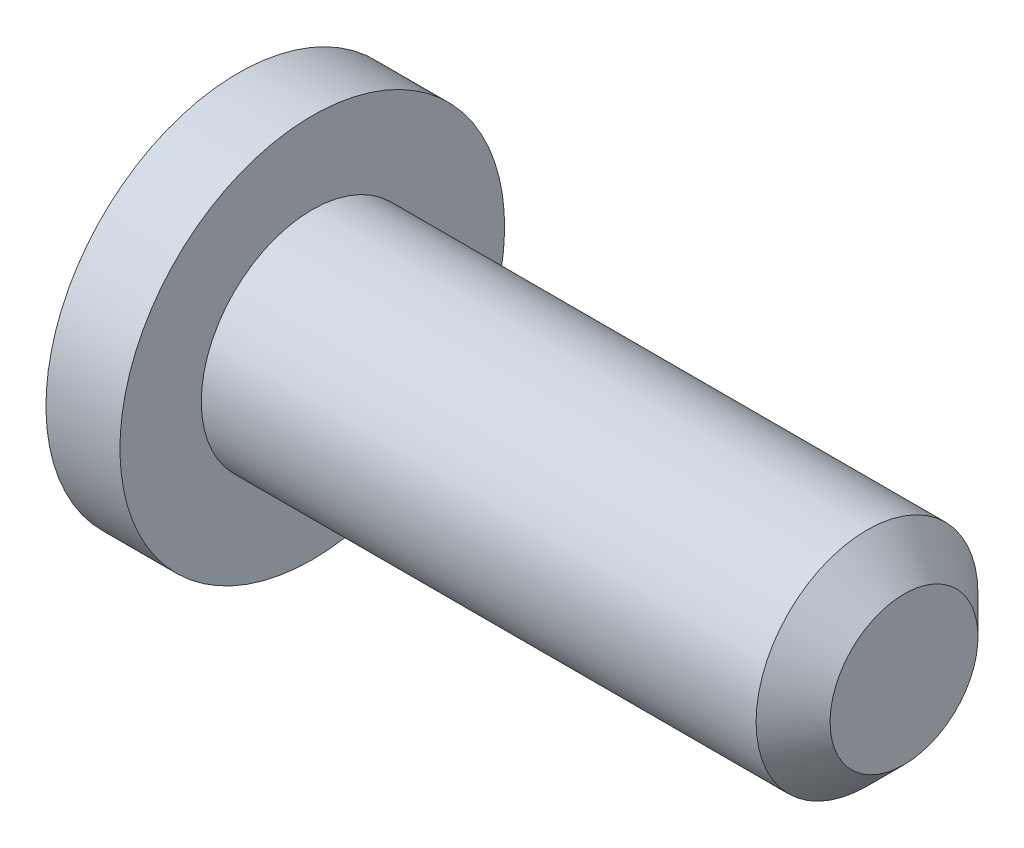
ISO-10303-21;
HEADER;
FILE_DESCRIPTION(('STEP AP214'),'2;1');
FILE_NAME('part.step','',(''),(''),'','','');
FILE_SCHEMA(('AUTOMOTIVE_DESIGN { 1 0 10303 214 1 1 1 1 }'));
ENDSEC;
DATA;
#1=APPLICATION_CONTEXT('core data for automotive mechanical design processes');
#2=APPLICATION_PROTOCOL_DEFINITION('international standard','automotive_design',2000,#1);
#3=PRODUCT_CONTEXT('',#1,'mechanical');
#4=PRODUCT('Part','Part','',(#3));
#5=PRODUCT_RELATED_PRODUCT_CATEGORY('part','',(#4));
#6=PRODUCT_DEFINITION_FORMATION('','',#4);
#7=PRODUCT_DEFINITION_CONTEXT('part definition',#1,'design');
#8=PRODUCT_DEFINITION('design','',#6,#7);
#9=PRODUCT_DEFINITION_SHAPE('','',#8);
#10=(LENGTH_UNIT() NAMED_UNIT(*) SI_UNIT(.MILLI.,.METRE.));
#11=(NAMED_UNIT(*) PLANE_ANGLE_UNIT() SI_UNIT($,.RADIAN.));
#12=(NAMED_UNIT(*) SI_UNIT($,.STERADIAN.) SOLID_ANGLE_UNIT());
#13=UNCERTAINTY_MEASURE_WITH_UNIT(LENGTH_MEASURE(1.E-05),#10,'distance_accuracy_value','');
#14=(GEOMETRIC_REPRESENTATION_CONTEXT(3) GLOBAL_UNCERTAINTY_ASSIGNED_CONTEXT((#13)) GLOBAL_UNIT_ASSIGNED_CONTEXT((#10,
#11,#12)) REPRESENTATION_CONTEXT('',''));
#15=CARTESIAN_POINT('',(0.,0.,0.));
#16=DIRECTION('',(0.,0.,1.));
#17=DIRECTION('',(1.,0.,0.));
#18=AXIS2_PLACEMENT_3D('',#15,#16,#17);
#19=CARTESIAN_POINT('',(-8.5,0.,0.));
#20=DIRECTION('',(-1.,0.,0.));
#21=DIRECTION('',(0.,0.,1.));
#22=AXIS2_PLACEMENT_3D('',#19,#20,#21);
#23=PLANE('',#22);
#24=DIRECTION('',(0.,1.,0.));
#25=VECTOR('',#24,1.);
#26=CARTESIAN_POINT('',(-8.5,0.250000000000001,0.25));
#27=LINE('',#26,#25);
#28=CARTESIAN_POINT('',(-8.5,0.250000000000001,0.25));
#29=VERTEX_POINT('',#28);
#30=CARTESIAN_POINT('',(-8.5,1.5,0.25));
#31=VERTEX_POINT('',#30);
#32=EDGE_CURVE('E280',#29,#31,#27,.T.);
#33=ORIENTED_EDGE('',*,*,#32,.T.);
#34=DIRECTION('',(0.,0.,1.));
#35=VECTOR('',#34,1.);
#36=CARTESIAN_POINT('',(-8.5,1.5,0.25));
#37=LINE('',#36,#35);
#38=CARTESIAN_POINT('',(-8.5,1.5,-0.25));
#39=VERTEX_POINT('',#38);
#40=EDGE_CURVE('E286',#31,#39,#37,.F.);
#41=ORIENTED_EDGE('',*,*,#40,.T.);
#42=DIRECTION('',(0.,1.,0.));
#43=VECTOR('',#42,1.);
#44=CARTESIAN_POINT('',(-8.5,0.249999999999998,-0.25));
#45=LINE('',#44,#43);
#46=CARTESIAN_POINT('',(-8.5,0.249999999999998,-0.25));
#47=VERTEX_POINT('',#46);
#48=EDGE_CURVE('E288',#47,#39,#45,.T.);
#49=ORIENTED_EDGE('',*,*,#48,.F.);
#50=DIRECTION('',(0.,0.,1.));
#51=VECTOR('',#50,1.);
#52=CARTESIAN_POINT('',(-8.5,0.249999999999998,-0.25));
#53=LINE('',#52,#51);
#54=CARTESIAN_POINT('',(-8.5,0.249999999999994,-1.5));
#55=VERTEX_POINT('',#54);
#56=EDGE_CURVE('E296',#47,#55,#53,.F.);
#57=ORIENTED_EDGE('',*,*,#56,.T.);
#58=DIRECTION('',(0.,1.,0.));
#59=VECTOR('',#58,1.);
#60=CARTESIAN_POINT('',(-8.5,0.249999999999994,-1.5));
#61=LINE('',#60,#59);
#62=CARTESIAN_POINT('',(-8.5,-0.250000000000006,-1.5));
#63=VERTEX_POINT('',#62);
#64=EDGE_CURVE('E239',#55,#63,#61,.F.);
#65=ORIENTED_EDGE('',*,*,#64,.T.);
#66=DIRECTION('',(0.,0.,1.));
#67=VECTOR('',#66,1.);
#68=CARTESIAN_POINT('',(-8.5,-0.250000000000002,-0.249999999999998));
#69=LINE('',#68,#67);
#70=CARTESIAN_POINT('',(-8.5,-0.250000000000002,-0.249999999999998));
#71=VERTEX_POINT('',#70);
#72=EDGE_CURVE('E243',#71,#63,#69,.F.);
#73=ORIENTED_EDGE('',*,*,#72,.F.);
#74=DIRECTION('',(0.,1.,0.));
#75=VECTOR('',#74,1.);
#76=CARTESIAN_POINT('',(-8.5,-0.250000000000002,-0.249999999999998));
#77=LINE('',#76,#75);
#78=CARTESIAN_POINT('',(-8.5,-1.5,-0.24999999999999));
#79=VERTEX_POINT('',#78);
#80=EDGE_CURVE('E241',#71,#79,#77,.F.);
#81=ORIENTED_EDGE('',*,*,#80,.T.);
#82=DIRECTION('',(0.,0.,-1.));
#83=VECTOR('',#82,1.);
#84=CARTESIAN_POINT('',(-8.5,-1.5,-0.24999999999999));
#85=LINE('',#84,#83);
#86=CARTESIAN_POINT('',(-8.5,-1.5,0.25000000000001));
#87=VERTEX_POINT('',#86);
#88=EDGE_CURVE('E209',#79,#87,#85,.F.);
#89=ORIENTED_EDGE('',*,*,#88,.T.);
#90=DIRECTION('',(0.,1.,0.));
#91=VECTOR('',#90,1.);
#92=CARTESIAN_POINT('',(-8.5,-0.249999999999999,0.250000000000002));
#93=LINE('',#92,#91);
#94=CARTESIAN_POINT('',(-8.5,-0.249999999999999,0.250000000000002));
#95=VERTEX_POINT('',#94);
#96=EDGE_CURVE('E254',#95,#87,#93,.F.);
#97=ORIENTED_EDGE('',*,*,#96,.F.);
#98=DIRECTION('',(0.,0.,-1.));
#99=VECTOR('',#98,1.);
#100=CARTESIAN_POINT('',(-8.5,-0.249999999999999,0.250000000000002));
#101=LINE('',#100,#99);
#102=CARTESIAN_POINT('',(-8.5,-0.249999999999985,1.5));
#103=VERTEX_POINT('',#102);
#104=EDGE_CURVE('E264',#95,#103,#101,.F.);
#105=ORIENTED_EDGE('',*,*,#104,.T.);
#106=DIRECTION('',(0.,-1.,0.));
#107=VECTOR('',#106,1.);
#108=CARTESIAN_POINT('',(-8.5,-0.249999999999985,1.5));
#109=LINE('',#108,#107);
#110=CARTESIAN_POINT('',(-8.5,0.250000000000015,1.5));
#111=VERTEX_POINT('',#110);
#112=EDGE_CURVE('E270',#103,#111,#109,.F.);
#113=ORIENTED_EDGE('',*,*,#112,.T.);
#114=DIRECTION('',(0.,0.,-1.));
#115=VECTOR('',#114,1.);
#116=CARTESIAN_POINT('',(-8.5,0.250000000000001,0.25));
#117=LINE('',#116,#115);
#118=EDGE_CURVE('E272',#29,#111,#117,.F.);
#119=ORIENTED_EDGE('',*,*,#118,.F.);
#120=EDGE_LOOP('',(#33,#41,#49,#57,#65,#73,#81,#89,#97,#105,#113,#119));
#121=FACE_BOUND('',#120,.T.);
#122=ADVANCED_FACE('F17',(#121),#23,.T.);
#123=CARTESIAN_POINT('',(-8.5,-0.250000000000002,-0.249999999999998));
#124=DIRECTION('',(0.,0.,-1.));
#125=DIRECTION('',(0.,1.,0.));
#126=AXIS2_PLACEMENT_3D('',#123,#124,#125);
#127=PLANE('',#126);
#128=ORIENTED_EDGE('',*,*,#80,.F.);
#129=DIRECTION('',(1.,0.,0.));
#130=VECTOR('',#129,1.);
#131=CARTESIAN_POINT('',(-8.5,-0.250000000000002,-0.249999999999998));
#132=LINE('',#131,#130);
#133=CARTESIAN_POINT('',(-9.71665303500248,-0.250000000000002,-0.249999999999998));
#134=VERTEX_POINT('',#133);
#135=EDGE_CURVE('E202',#134,#71,#132,.T.);
#136=ORIENTED_EDGE('',*,*,#135,.F.);
#137=CARTESIAN_POINT('',(-9.49230842000189,-1.5,-0.249999999999989));
#138=CARTESIAN_POINT('',(-9.5083030129866,-1.44921138353586,-0.24999999999999));
#139=CARTESIAN_POINT('',(-9.52348468425343,-1.39816679089405,-0.24999999999999));
#140=CARTESIAN_POINT('',(-9.55216436663693,-1.29577393035538,-0.249999999999991));
#141=CARTESIAN_POINT('',(-9.56566734986892,-1.24442705508593,-0.249999999999991));
#142=CARTESIAN_POINT('',(-9.59100346294,-1.14143316569971,-0.249999999999992));
#143=CARTESIAN_POINT('',(-9.60283991671721,-1.08978696924392,-0.249999999999992));
#144=CARTESIAN_POINT('',(-9.62485219958465,-0.986196748979922,-0.249999999999993));
#145=CARTESIAN_POINT('',(-9.63502970400095,-0.934253081162451,-0.249999999999994));
#146=CARTESIAN_POINT('',(-9.6537283106915,-0.83006846160683,-0.249999999999994));
#147=CARTESIAN_POINT('',(-9.66224941296575,-0.777827509868681,-0.249999999999995));
#148=CARTESIAN_POINT('',(-9.67763445650969,-0.673047861241045,-0.249999999999995));
#149=CARTESIAN_POINT('',(-9.6844967032191,-0.620508915529611,-0.249999999999996));
#150=CARTESIAN_POINT('',(-9.69655799162055,-0.51513251779962,-0.249999999999996));
#151=CARTESIAN_POINT('',(-9.70175363248873,-0.462294676510745,-0.249999999999997));
#152=CARTESIAN_POINT('',(-9.71047102489062,-0.356319070163704,-0.249999999999997));
#153=CARTESIAN_POINT('',(-9.7139876303459,-0.303180881763142,-0.249999999999997));
#154=CARTESIAN_POINT('',(-9.71665303500248,-0.250000000000001,-0.249999999999997));
#155=B_SPLINE_CURVE_WITH_KNOTS('',3,(#137,#138,#139,#140,#141,#142,#143,#144,#145,#146,#147,
#148,#149,#150,#151,#152,#153,#154),.UNSPECIFIED.,.F.,.F.,(4,2,2,2,2,2,2,2,4),(0.,
0.159736038114362,0.318987071741275,0.477915833445836,0.636683089573138,0.79545034570044,
0.954379107405002,1.11363014103191,1.27336617914628),.UNSPECIFIED.);
#156=CARTESIAN_POINT('',(-9.49230842000189,-1.5,-0.249999999999989));
#157=VERTEX_POINT('',#156);
#158=EDGE_CURVE('E20',#157,#134,#155,.T.);
#159=ORIENTED_EDGE('',*,*,#158,.F.);
#160=DIRECTION('',(1.,0.,0.));
#161=VECTOR('',#160,1.);
#162=CARTESIAN_POINT('',(-8.5,-1.5,-0.24999999999999));
#163=LINE('',#162,#161);
#164=EDGE_CURVE('E88',#157,#79,#163,.T.);
#165=ORIENTED_EDGE('',*,*,#164,.T.);
#166=EDGE_LOOP('',(#128,#136,#159,#165));
#167=FACE_BOUND('',#166,.T.);
#168=ADVANCED_FACE('F199',(#167),#127,.F.);
#169=CARTESIAN_POINT('',(-8.5,-0.250000000000002,-0.249999999999998));
#170=DIRECTION('',(0.,1.,0.));
#171=DIRECTION('',(0.,0.,1.));
#172=AXIS2_PLACEMENT_3D('',#169,#170,#171);
#173=PLANE('',#172);
#174=ORIENTED_EDGE('',*,*,#72,.T.);
#175=DIRECTION('',(1.,0.,0.));
#176=VECTOR('',#175,1.);
#177=CARTESIAN_POINT('',(-8.5,-0.250000000000006,-1.5));
#178=LINE('',#177,#176);
#179=CARTESIAN_POINT('',(-9.49230842000189,-0.250000000000004,-1.5));
#180=VERTEX_POINT('',#179);
#181=EDGE_CURVE('E299',#63,#180,#178,.F.);
#182=ORIENTED_EDGE('',*,*,#181,.T.);
#183=CARTESIAN_POINT('',(-4.72916869918748,-0.250000000000001,0.));
#184=DIRECTION('',(0.,1.,0.));
#185=DIRECTION('',(-1.,0.,0.));
#186=AXIS2_PLACEMENT_3D('',#183,#184,#185);
#187=CIRCLE('',#186,4.99374608885954);
#188=EDGE_CURVE('E194',#134,#180,#187,.F.);
#189=ORIENTED_EDGE('',*,*,#188,.F.);
#190=ORIENTED_EDGE('',*,*,#135,.T.);
#191=EDGE_LOOP('',(#174,#182,#189,#190));
#192=FACE_BOUND('',#191,.T.);
#193=ADVANCED_FACE('F187',(#192),#173,.T.);
#194=CARTESIAN_POINT('',(-8.5,0.249999999999994,-1.5));
#195=DIRECTION('',(0.,0.,-1.));
#196=DIRECTION('',(0.,1.,0.));
#197=AXIS2_PLACEMENT_3D('',#194,#195,#196);
#198=PLANE('',#197);
#199=ORIENTED_EDGE('',*,*,#64,.F.);
#200=DIRECTION('',(1.,0.,0.));
#201=VECTOR('',#200,1.);
#202=CARTESIAN_POINT('',(-8.5,0.249999999999994,-1.5));
#203=LINE('',#202,#201);
#204=CARTESIAN_POINT('',(-9.49230842000189,0.249999999999994,-1.5));
#205=VERTEX_POINT('',#204);
#206=EDGE_CURVE('E298',#55,#205,#203,.F.);
#207=ORIENTED_EDGE('',*,*,#206,.T.);
#208=CARTESIAN_POINT('',(-9.49230842000189,-0.250000000000005,-1.5));
#209=CARTESIAN_POINT('',(-9.49667927751543,-0.166666666666672,-1.5));
#210=CARTESIAN_POINT('',(-9.49886470627221,-0.0833333333333389,-1.5));
#211=CARTESIAN_POINT('',(-9.49886470627221,0.0833333333333275,-1.5));
#212=CARTESIAN_POINT('',(-9.49667927751543,0.166666666666661,-1.5));
#213=CARTESIAN_POINT('',(-9.49230842000189,0.249999999999994,-1.5));
#214=B_SPLINE_CURVE_WITH_KNOTS('',3,(#208,#209,#210,#211,#212,#213),.UNSPECIFIED.,.F.,.F.,(4,2,
4),(0.,0.250085955002791,0.500171910005583),.UNSPECIFIED.);
#215=EDGE_CURVE('E189',#180,#205,#214,.T.);
#216=ORIENTED_EDGE('',*,*,#215,.F.);
#217=ORIENTED_EDGE('',*,*,#181,.F.);
#218=EDGE_LOOP('',(#199,#207,#216,#217));
#219=FACE_BOUND('',#218,.T.);
#220=ADVANCED_FACE('F182',(#219),#198,.F.);
#221=CARTESIAN_POINT('',(-8.5,0.249999999999998,-0.25));
#222=DIRECTION('',(0.,1.,0.));
#223=DIRECTION('',(0.,0.,1.));
#224=AXIS2_PLACEMENT_3D('',#221,#222,#223);
#225=PLANE('',#224);
#226=ORIENTED_EDGE('',*,*,#56,.F.);
#227=DIRECTION('',(1.,0.,0.));
#228=VECTOR('',#227,1.);
#229=CARTESIAN_POINT('',(-8.5,0.249999999999998,-0.25));
#230=LINE('',#229,#228);
#231=CARTESIAN_POINT('',(-9.71665303500248,0.249999999999997,-0.25));
#232=VERTEX_POINT('',#231);
#233=EDGE_CURVE('E293',#232,#47,#230,.T.);
#234=ORIENTED_EDGE('',*,*,#233,.F.);
#235=CARTESIAN_POINT('',(-4.72916869918748,0.249999999999995,0.));
#236=DIRECTION('',(0.,1.,0.));
#237=DIRECTION('',(-1.,0.,0.));
#238=AXIS2_PLACEMENT_3D('',#235,#236,#237);
#239=CIRCLE('',#238,4.99374608885955);
#240=EDGE_CURVE('E172',#205,#232,#239,.T.);
#241=ORIENTED_EDGE('',*,*,#240,.F.);
#242=ORIENTED_EDGE('',*,*,#206,.F.);
#243=EDGE_LOOP('',(#226,#234,#241,#242));
#244=FACE_BOUND('',#243,.T.);
#245=ADVANCED_FACE('F178',(#244),#225,.F.);
#246=CARTESIAN_POINT('',(-8.5,0.249999999999998,-0.25));
#247=DIRECTION('',(0.,0.,1.));
#248=DIRECTION('',(1.,0.,0.));
#249=AXIS2_PLACEMENT_3D('',#246,#247,#248);
#250=PLANE('',#249);
#251=ORIENTED_EDGE('',*,*,#48,.T.);
#252=DIRECTION('',(-1.,0.,0.));
#253=VECTOR('',#252,1.);
#254=CARTESIAN_POINT('',(-8.5,1.5,-0.25));
#255=LINE('',#254,#253);
#256=CARTESIAN_POINT('',(-9.49230842000189,1.5,-0.25));
#257=VERTEX_POINT('',#256);
#258=EDGE_CURVE('E283',#39,#257,#255,.T.);
#259=ORIENTED_EDGE('',*,*,#258,.T.);
#260=CARTESIAN_POINT('',(-9.71665303500248,0.249999999999997,-0.25));
#261=CARTESIAN_POINT('',(-9.7139876303459,0.303180881763138,-0.25));
#262=CARTESIAN_POINT('',(-9.71047102489062,0.356319070163701,-0.25));
#263=CARTESIAN_POINT('',(-9.70175363248873,0.462294676510741,-0.25));
#264=CARTESIAN_POINT('',(-9.69655799162055,0.515132517799616,-0.25));
#265=CARTESIAN_POINT('',(-9.6844967032191,0.620508915529607,-0.25));
#266=CARTESIAN_POINT('',(-9.67763445650969,0.673047861241041,-0.25));
#267=CARTESIAN_POINT('',(-9.66224941296575,0.777827509868677,-0.25));
#268=CARTESIAN_POINT('',(-9.6537283106915,0.830068461606826,-0.25));
#269=CARTESIAN_POINT('',(-9.63502970400095,0.934253081162447,-0.25));
#270=CARTESIAN_POINT('',(-9.62485219958465,0.986196748979918,-0.25));
#271=CARTESIAN_POINT('',(-9.60283991671721,1.08978696924392,-0.25));
#272=CARTESIAN_POINT('',(-9.59100346294,1.1414331656997,-0.25));
#273=CARTESIAN_POINT('',(-9.56566734986892,1.24442705508593,-0.25));
#274=CARTESIAN_POINT('',(-9.55216436663693,1.29577393035537,-0.25));
#275=CARTESIAN_POINT('',(-9.52348468425343,1.39816679089405,-0.25));
#276=CARTESIAN_POINT('',(-9.5083030129866,1.44921138353585,-0.25));
#277=CARTESIAN_POINT('',(-9.49230842000189,1.5,-0.249999999999999));
#278=B_SPLINE_CURVE_WITH_KNOTS('',3,(#260,#261,#262,#263,#264,#265,#266,#267,#268,#269,#270,
#271,#272,#273,#274,#275,#276,#277),.UNSPECIFIED.,.F.,.F.,(4,2,2,2,2,2,2,2,4),(0.,
0.159736038114362,0.318987071741274,0.477915833445835,0.636683089573137,0.795450345700439,
0.954379107405001,1.11363014103191,1.27336617914628),.UNSPECIFIED.);
#279=EDGE_CURVE('E165',#232,#257,#278,.T.);
#280=ORIENTED_EDGE('',*,*,#279,.F.);
#281=ORIENTED_EDGE('',*,*,#233,.T.);
#282=EDGE_LOOP('',(#251,#259,#280,#281));
#283=FACE_BOUND('',#282,.T.);
#284=ADVANCED_FACE('F174',(#283),#250,.T.);
#285=CARTESIAN_POINT('',(-8.5,1.5,0.25));
#286=DIRECTION('',(0.,1.,0.));
#287=DIRECTION('',(-1.,0.,0.));
#288=AXIS2_PLACEMENT_3D('',#285,#286,#287);
#289=PLANE('',#288);
#290=ORIENTED_EDGE('',*,*,#40,.F.);
#291=DIRECTION('',(1.,0.,0.));
#292=VECTOR('',#291,1.);
#293=CARTESIAN_POINT('',(-8.5,1.5,0.25));
#294=LINE('',#293,#292);
#295=CARTESIAN_POINT('',(-9.49230842000189,1.5,0.25));
#296=VERTEX_POINT('',#295);
#297=EDGE_CURVE('E282',#31,#296,#294,.F.);
#298=ORIENTED_EDGE('',*,*,#297,.T.);
#299=CARTESIAN_POINT('',(-9.4988647062722,1.5,0.));
#300=CARTESIAN_POINT('',(-9.4988647062722,1.5,0.125085969779303));
#301=CARTESIAN_POINT('',(-9.49230842000189,1.5,0.25));
#302=B_SPLINE_CURVE_WITH_KNOTS('',2,(#299,#300,#301),.UNSPECIFIED.,.F.,.F.,(3,3),(0.,1.),.UNSPECIFIED.);
#303=CARTESIAN_POINT('',(-9.4988647062722,1.5,0.));
#304=VERTEX_POINT('',#303);
#305=EDGE_CURVE('E164',#304,#296,#302,.T.);
#306=ORIENTED_EDGE('',*,*,#305,.F.);
#307=CARTESIAN_POINT('',(-9.49230842000189,1.5,-0.25));
#308=CARTESIAN_POINT('',(-9.4988647062722,1.5,-0.125085969779294));
#309=CARTESIAN_POINT('',(-9.4988647062722,1.5,0.));
#310=B_SPLINE_CURVE_WITH_KNOTS('',2,(#307,#308,#309),.UNSPECIFIED.,.F.,.F.,(3,3),(0.,1.),.UNSPECIFIED.);
#311=EDGE_CURVE('E171',#257,#304,#310,.T.);
#312=ORIENTED_EDGE('',*,*,#311,.F.);
#313=ORIENTED_EDGE('',*,*,#258,.F.);
#314=EDGE_LOOP('',(#290,#298,#306,#312,#313));
#315=FACE_BOUND('',#314,.T.);
#316=ADVANCED_FACE('F154',(#315),#289,.F.);
#317=CARTESIAN_POINT('',(-8.5,0.250000000000001,0.25));
#318=DIRECTION('',(0.,0.,1.));
#319=DIRECTION('',(1.,0.,0.));
#320=AXIS2_PLACEMENT_3D('',#317,#318,#319);
#321=PLANE('',#320);
#322=ORIENTED_EDGE('',*,*,#32,.F.);
#323=DIRECTION('',(1.,0.,0.));
#324=VECTOR('',#323,1.);
#325=CARTESIAN_POINT('',(-8.5,0.250000000000001,0.25));
#326=LINE('',#325,#324);
#327=CARTESIAN_POINT('',(-9.71665303500247,0.250000000000002,0.25));
#328=VERTEX_POINT('',#327);
#329=EDGE_CURVE('E277',#328,#29,#326,.T.);
#330=ORIENTED_EDGE('',*,*,#329,.F.);
#331=CARTESIAN_POINT('',(-9.49230842000189,1.5,0.250000000000001));
#332=CARTESIAN_POINT('',(-9.5083030129866,1.44921138353585,0.25));
#333=CARTESIAN_POINT('',(-9.52348468425342,1.39816679089405,0.25));
#334=CARTESIAN_POINT('',(-9.55216436663692,1.29577393035537,0.25));
#335=CARTESIAN_POINT('',(-9.56566734986892,1.24442705508593,0.25));
#336=CARTESIAN_POINT('',(-9.59100346294,1.1414331656997,0.25));
#337=CARTESIAN_POINT('',(-9.60283991671721,1.08978696924392,0.25));
#338=CARTESIAN_POINT('',(-9.62485219958465,0.98619674897992,0.25));
#339=CARTESIAN_POINT('',(-9.63502970400095,0.934253081162449,0.25));
#340=CARTESIAN_POINT('',(-9.6537283106915,0.830068461606829,0.25));
#341=CARTESIAN_POINT('',(-9.66224941296575,0.77782750986868,0.25));
#342=CARTESIAN_POINT('',(-9.67763445650969,0.673047861241044,0.25));
#343=CARTESIAN_POINT('',(-9.6844967032191,0.620508915529611,0.25));
#344=CARTESIAN_POINT('',(-9.69655799162055,0.51513251779962,0.25));
#345=CARTESIAN_POINT('',(-9.70175363248873,0.462294676510744,0.25));
#346=CARTESIAN_POINT('',(-9.71047102489062,0.356319070163705,0.25));
#347=CARTESIAN_POINT('',(-9.7139876303459,0.303180881763143,0.250000000000001));
#348=CARTESIAN_POINT('',(-9.71665303500248,0.250000000000002,0.250000000000001));
#349=B_SPLINE_CURVE_WITH_KNOTS('',3,(#331,#332,#333,#334,#335,#336,#337,#338,#339,#340,#341,
#342,#343,#344,#345,#346,#347,#348),.UNSPECIFIED.,.F.,.F.,(4,2,2,2,2,2,2,2,4),(0.,
0.159736038114361,0.318987071741273,0.477915833445835,0.636683089573136,0.795450345700437,
0.954379107404998,1.11363014103191,1.27336617914627),.UNSPECIFIED.);
#350=EDGE_CURVE('E158',#296,#328,#349,.T.);
#351=ORIENTED_EDGE('',*,*,#350,.F.);
#352=ORIENTED_EDGE('',*,*,#297,.F.);
#353=EDGE_LOOP('',(#322,#330,#351,#352));
#354=FACE_BOUND('',#353,.T.);
#355=ADVANCED_FACE('F149',(#354),#321,.F.);
#356=CARTESIAN_POINT('',(-8.5,0.250000000000001,0.25));
#357=DIRECTION('',(0.,-1.,0.));
#358=DIRECTION('',(0.,0.,-1.));
#359=AXIS2_PLACEMENT_3D('',#356,#357,#358);
#360=PLANE('',#359);
#361=ORIENTED_EDGE('',*,*,#118,.T.);
#362=DIRECTION('',(1.,0.,0.));
#363=VECTOR('',#362,1.);
#364=CARTESIAN_POINT('',(-8.5,0.250000000000015,1.5));
#365=LINE('',#364,#363);
#366=CARTESIAN_POINT('',(-9.49230842000189,0.250000000000008,1.5));
#367=VERTEX_POINT('',#366);
#368=EDGE_CURVE('E267',#111,#367,#365,.F.);
#369=ORIENTED_EDGE('',*,*,#368,.T.);
#370=CARTESIAN_POINT('',(-4.72916869918748,0.250000000000002,0.));
#371=DIRECTION('',(0.,1.,0.));
#372=DIRECTION('',(-1.,0.,0.));
#373=AXIS2_PLACEMENT_3D('',#370,#371,#372);
#374=CIRCLE('',#373,4.99374608885954);
#375=EDGE_CURVE('E139',#328,#367,#374,.T.);
#376=ORIENTED_EDGE('',*,*,#375,.F.);
#377=ORIENTED_EDGE('',*,*,#329,.T.);
#378=EDGE_LOOP('',(#361,#369,#376,#377));
#379=FACE_BOUND('',#378,.T.);
#380=ADVANCED_FACE('F145',(#379),#360,.T.);
#381=CARTESIAN_POINT('',(-8.5,-0.249999999999985,1.5));
#382=DIRECTION('',(0.,0.,1.));
#383=DIRECTION('',(0.,-1.,0.));
#384=AXIS2_PLACEMENT_3D('',#381,#382,#383);
#385=PLANE('',#384);
#386=ORIENTED_EDGE('',*,*,#112,.F.);
#387=DIRECTION('',(1.,0.,0.));
#388=VECTOR('',#387,1.);
#389=CARTESIAN_POINT('',(-8.5,-0.249999999999985,1.5));
#390=LINE('',#389,#388);
#391=CARTESIAN_POINT('',(-9.49230842000189,-0.249999999999985,1.5));
#392=VERTEX_POINT('',#391);
#393=EDGE_CURVE('E266',#103,#392,#390,.F.);
#394=ORIENTED_EDGE('',*,*,#393,.T.);
#395=CARTESIAN_POINT('',(-9.49230842000189,0.250000000000012,1.5));
#396=CARTESIAN_POINT('',(-9.49667927751543,0.166666666666679,1.5));
#397=CARTESIAN_POINT('',(-9.49886470627221,0.083333333333346,1.5));
#398=CARTESIAN_POINT('',(-9.49886470627221,-0.0833333333333197,1.5));
#399=CARTESIAN_POINT('',(-9.49667927751543,-0.166666666666653,1.5));
#400=CARTESIAN_POINT('',(-9.49230842000189,-0.249999999999985,1.5));
#401=B_SPLINE_CURVE_WITH_KNOTS('',3,(#395,#396,#397,#398,#399,#400),.UNSPECIFIED.,.F.,.F.,(4,2,
4),(0.,0.25008595500279,0.500171910005581),.UNSPECIFIED.);
#402=EDGE_CURVE('E133',#367,#392,#401,.T.);
#403=ORIENTED_EDGE('',*,*,#402,.F.);
#404=ORIENTED_EDGE('',*,*,#368,.F.);
#405=EDGE_LOOP('',(#386,#394,#403,#404));
#406=FACE_BOUND('',#405,.T.);
#407=ADVANCED_FACE('F141',(#406),#385,.F.);
#408=CARTESIAN_POINT('',(-8.5,-0.249999999999999,0.250000000000002));
#409=DIRECTION('',(0.,-1.,0.));
#410=DIRECTION('',(0.,0.,-1.));
#411=AXIS2_PLACEMENT_3D('',#408,#409,#410);
#412=PLANE('',#411);
#413=ORIENTED_EDGE('',*,*,#104,.F.);
#414=DIRECTION('',(1.,0.,0.));
#415=VECTOR('',#414,1.);
#416=CARTESIAN_POINT('',(-8.5,-0.249999999999999,0.250000000000002));
#417=LINE('',#416,#415);
#418=CARTESIAN_POINT('',(-9.71665303500247,-0.249999999999992,0.250000000000002));
#419=VERTEX_POINT('',#418);
#420=EDGE_CURVE('E256',#419,#95,#417,.T.);
#421=ORIENTED_EDGE('',*,*,#420,.F.);
#422=CARTESIAN_POINT('',(-4.72916869918748,-0.249999999999984,0.));
#423=DIRECTION('',(0.,1.,0.));
#424=DIRECTION('',(-1.,0.,0.));
#425=AXIS2_PLACEMENT_3D('',#422,#423,#424);
#426=CIRCLE('',#425,4.99374608885954);
#427=EDGE_CURVE('E101',#392,#419,#426,.F.);
#428=ORIENTED_EDGE('',*,*,#427,.F.);
#429=ORIENTED_EDGE('',*,*,#393,.F.);
#430=EDGE_LOOP('',(#413,#421,#428,#429));
#431=FACE_BOUND('',#430,.T.);
#432=ADVANCED_FACE('F125',(#431),#412,.F.);
#433=CARTESIAN_POINT('',(-8.5,-0.249999999999999,0.250000000000002));
#434=DIRECTION('',(0.,0.,-1.));
#435=DIRECTION('',(0.,1.,0.));
#436=AXIS2_PLACEMENT_3D('',#433,#434,#435);
#437=PLANE('',#436);
#438=ORIENTED_EDGE('',*,*,#96,.T.);
#439=DIRECTION('',(1.,0.,0.));
#440=VECTOR('',#439,1.);
#441=CARTESIAN_POINT('',(-8.5,-1.5,0.25000000000001));
#442=LINE('',#441,#440);
#443=CARTESIAN_POINT('',(-9.49230842000189,-1.5,0.25000000000001));
#444=VERTEX_POINT('',#443);
#445=EDGE_CURVE('E39',#87,#444,#442,.F.);
#446=ORIENTED_EDGE('',*,*,#445,.T.);
#447=CARTESIAN_POINT('',(-9.71665303500248,-0.249999999999997,0.25));
#448=CARTESIAN_POINT('',(-9.7139876303459,-0.303180881763138,0.250000000000002));
#449=CARTESIAN_POINT('',(-9.71047102489062,-0.3563190701637,0.250000000000002));
#450=CARTESIAN_POINT('',(-9.70175363248873,-0.46229467651074,0.250000000000003));
#451=CARTESIAN_POINT('',(-9.69655799162055,-0.515132517799616,0.250000000000004));
#452=CARTESIAN_POINT('',(-9.6844967032191,-0.620508915529607,0.250000000000004));
#453=CARTESIAN_POINT('',(-9.67763445650969,-0.673047861241041,0.250000000000005));
#454=CARTESIAN_POINT('',(-9.66224941296575,-0.777827509868677,0.250000000000005));
#455=CARTESIAN_POINT('',(-9.6537283106915,-0.830068461606826,0.250000000000006));
#456=CARTESIAN_POINT('',(-9.63502970400095,-0.934253081162447,0.250000000000006));
#457=CARTESIAN_POINT('',(-9.62485219958465,-0.986196748979919,0.250000000000007));
#458=CARTESIAN_POINT('',(-9.60283991671721,-1.08978696924392,0.250000000000008));
#459=CARTESIAN_POINT('',(-9.59100346294,-1.1414331656997,0.250000000000008));
#460=CARTESIAN_POINT('',(-9.56566734986892,-1.24442705508593,0.250000000000009));
#461=CARTESIAN_POINT('',(-9.55216436663693,-1.29577393035537,0.250000000000009));
#462=CARTESIAN_POINT('',(-9.52348468425343,-1.39816679089405,0.25000000000001));
#463=CARTESIAN_POINT('',(-9.5083030129866,-1.44921138353586,0.25000000000001));
#464=CARTESIAN_POINT('',(-9.49230842000189,-1.5,0.250000000000011));
#465=B_SPLINE_CURVE_WITH_KNOTS('',3,(#447,#448,#449,#450,#451,#452,#453,#454,#455,#456,#457,
#458,#459,#460,#461,#462,#463,#464),.UNSPECIFIED.,.F.,.F.,(4,2,2,2,2,2,2,2,4),(0.,
0.159736038114363,0.318987071741275,0.477915833445836,0.636683089573138,0.795450345700441,
0.954379107405002,1.11363014103191,1.27336617914628),.UNSPECIFIED.);
#466=EDGE_CURVE('E95',#419,#444,#465,.T.);
#467=ORIENTED_EDGE('',*,*,#466,.F.);
#468=ORIENTED_EDGE('',*,*,#420,.T.);
#469=EDGE_LOOP('',(#438,#446,#467,#468));
#470=FACE_BOUND('',#469,.T.);
#471=ADVANCED_FACE('F118',(#470),#437,.T.);
#472=CARTESIAN_POINT('',(-8.5,-1.5,-0.24999999999999));
#473=DIRECTION('',(0.,-1.,0.));
#474=DIRECTION('',(0.,0.,-1.));
#475=AXIS2_PLACEMENT_3D('',#472,#473,#474);
#476=PLANE('',#475);
#477=ORIENTED_EDGE('',*,*,#88,.F.);
#478=ORIENTED_EDGE('',*,*,#164,.F.);
#479=CARTESIAN_POINT('',(-9.4988647062722,-1.5,0.));
#480=CARTESIAN_POINT('',(-9.4988647062722,-1.5,-0.125085969779303));
#481=CARTESIAN_POINT('',(-9.49230842000189,-1.5,-0.24999999999999));
#482=B_SPLINE_CURVE_WITH_KNOTS('',2,(#479,#480,#481),.UNSPECIFIED.,.F.,.F.,(3,3),(0.,1.),.UNSPECIFIED.);
#483=CARTESIAN_POINT('',(-9.4988647062722,-1.5,0.));
#484=VERTEX_POINT('',#483);
#485=EDGE_CURVE('E81',#484,#157,#482,.T.);
#486=ORIENTED_EDGE('',*,*,#485,.F.);
#487=CARTESIAN_POINT('',(-9.49230842000189,-1.5,0.25000000000001));
#488=CARTESIAN_POINT('',(-9.4988647062722,-1.5,0.125085969779343));
#489=CARTESIAN_POINT('',(-9.4988647062722,-1.5,0.));
#490=B_SPLINE_CURVE_WITH_KNOTS('',2,(#487,#488,#489),.UNSPECIFIED.,.F.,.F.,(3,3),(0.,1.),.UNSPECIFIED.);
#491=EDGE_CURVE('E85',#444,#484,#490,.T.);
#492=ORIENTED_EDGE('',*,*,#491,.F.);
#493=ORIENTED_EDGE('',*,*,#445,.F.);
#494=EDGE_LOOP('',(#477,#478,#486,#492,#493));
#495=FACE_BOUND('',#494,.T.);
#496=ADVANCED_FACE('F84',(#495),#476,.F.);
#497=CARTESIAN_POINT('',(-4.72916869918748,0.,0.));
#498=DIRECTION('',(0.,1.,0.));
#499=DIRECTION('',(1.,0.,0.));
#500=AXIS2_PLACEMENT_3D('',#497,#498,#499);
#501=SPHERICAL_SURFACE('',#500,5.);
#502=CARTESIAN_POINT('',(-9.,0.,0.));
#503=DIRECTION('',(-1.,0.,0.));
#504=DIRECTION('',(0.,-1.,0.));
#505=AXIS2_PLACEMENT_3D('',#502,#503,#504);
#506=CIRCLE('',#505,2.6);
#507=CARTESIAN_POINT('',(-9.,-2.6,0.));
#508=VERTEX_POINT('',#507);
#509=EDGE_CURVE('E96',#508,#508,#506,.F.);
#510=ORIENTED_EDGE('',*,*,#509,.F.);
#511=EDGE_LOOP('',(#510));
#512=FACE_BOUND('',#511,.T.);
#513=ORIENTED_EDGE('',*,*,#466,.T.);
#514=ORIENTED_EDGE('',*,*,#491,.T.);
#515=ORIENTED_EDGE('',*,*,#485,.T.);
#516=ORIENTED_EDGE('',*,*,#158,.T.);
#517=ORIENTED_EDGE('',*,*,#188,.T.);
#518=ORIENTED_EDGE('',*,*,#215,.T.);
#519=ORIENTED_EDGE('',*,*,#240,.T.);
#520=ORIENTED_EDGE('',*,*,#279,.T.);
#521=ORIENTED_EDGE('',*,*,#311,.T.);
#522=ORIENTED_EDGE('',*,*,#305,.T.);
#523=ORIENTED_EDGE('',*,*,#350,.T.);
#524=ORIENTED_EDGE('',*,*,#375,.T.);
#525=ORIENTED_EDGE('',*,*,#402,.T.);
#526=ORIENTED_EDGE('',*,*,#427,.T.);
#527=EDGE_LOOP('',(#513,#514,#515,#516,#517,#518,#519,#520,#521,#522,#523,#524,#525,#526));
#528=FACE_BOUND('',#527,.T.);
#529=ADVANCED_FACE('F93',(#512,#528),#501,.T.);
#530=CARTESIAN_POINT('',(0.,1.5,0.));
#531=DIRECTION('',(-1.,0.,0.));
#532=DIRECTION('',(0.,-1.,0.));
#533=AXIS2_PLACEMENT_3D('',#530,#531,#532);
#534=PLANE('',#533);
#535=CARTESIAN_POINT('',(0.,0.,0.));
#536=DIRECTION('',(-1.,0.,0.));
#537=DIRECTION('',(0.,-1.,0.));
#538=AXIS2_PLACEMENT_3D('',#535,#536,#537);
#539=CIRCLE('',#538,1.0000000000332);
#540=CARTESIAN_POINT('',(0.,-1.0000000000332,0.));
#541=VERTEX_POINT('',#540);
#542=EDGE_CURVE('E99',#541,#541,#539,.T.);
#543=ORIENTED_EDGE('',*,*,#542,.F.);
#544=EDGE_LOOP('',(#543));
#545=FACE_BOUND('',#544,.T.);
#546=ADVANCED_FACE('F314',(#545),#534,.F.);
#547=CARTESIAN_POINT('',(-9.72916869918748,0.,0.));
#548=DIRECTION('',(-1.,0.,0.));
#549=DIRECTION('',(0.,-1.,0.));
#550=AXIS2_PLACEMENT_3D('',#547,#548,#549);
#551=CYLINDRICAL_SURFACE('',#550,2.6);
#552=ORIENTED_EDGE('',*,*,#509,.T.);
#553=EDGE_LOOP('',(#552));
#554=FACE_BOUND('',#553,.T.);
#555=CARTESIAN_POINT('',(-8.,0.,0.));
#556=DIRECTION('',(-1.,0.,0.));
#557=DIRECTION('',(0.,-1.,0.));
#558=AXIS2_PLACEMENT_3D('',#555,#556,#557);
#559=CIRCLE('',#558,2.6);
#560=CARTESIAN_POINT('',(-8.,-2.6,0.));
#561=VERTEX_POINT('',#560);
#562=EDGE_CURVE('E307',#561,#561,#559,.T.);
#563=ORIENTED_EDGE('',*,*,#562,.T.);
#564=EDGE_LOOP('',(#563));
#565=FACE_BOUND('',#564,.T.);
#566=ADVANCED_FACE('F316',(#554,#565),#551,.T.);
#567=CARTESIAN_POINT('',(-0.49999999987449,0.,0.));
#568=DIRECTION('',(-1.,0.,0.));
#569=DIRECTION('',(0.,-1.,0.));
#570=AXIS2_PLACEMENT_3D('',#567,#568,#569);
#571=CONICAL_SURFACE('',#570,1.49999999990769,0.785398163397448);
#572=CARTESIAN_POINT('',(-0.500000000000004,0.,0.));
#573=DIRECTION('',(-1.,0.,0.));
#574=DIRECTION('',(0.,-1.,0.));
#575=AXIS2_PLACEMENT_3D('',#572,#573,#574);
#576=CIRCLE('',#575,1.5);
#577=CARTESIAN_POINT('',(-0.500000000000004,-1.5,0.));
#578=VERTEX_POINT('',#577);
#579=EDGE_CURVE('E30',#578,#578,#576,.T.);
#580=ORIENTED_EDGE('',*,*,#579,.F.);
#581=EDGE_LOOP('',(#580));
#582=FACE_BOUND('',#581,.T.);
#583=ORIENTED_EDGE('',*,*,#542,.T.);
#584=EDGE_LOOP('',(#583));
#585=FACE_BOUND('',#584,.T.);
#586=ADVANCED_FACE('F312',(#582,#585),#571,.T.);
#587=CARTESIAN_POINT('',(-8.,1.5,0.));
#588=DIRECTION('',(-1.,0.,0.));
#589=DIRECTION('',(0.,-1.,0.));
#590=AXIS2_PLACEMENT_3D('',#587,#588,#589);
#591=PLANE('',#590);
#592=CARTESIAN_POINT('',(-8.,0.,0.));
#593=DIRECTION('',(-1.,0.,0.));
#594=DIRECTION('',(0.,-1.,0.));
#595=AXIS2_PLACEMENT_3D('',#592,#593,#594);
#596=CIRCLE('',#595,1.5);
#597=CARTESIAN_POINT('',(-8.,-1.5,0.));
#598=VERTEX_POINT('',#597);
#599=EDGE_CURVE('E11',#598,#598,#596,.F.);
#600=ORIENTED_EDGE('',*,*,#599,.F.);
#601=EDGE_LOOP('',(#600));
#602=FACE_BOUND('',#601,.T.);
#603=ORIENTED_EDGE('',*,*,#562,.F.);
#604=EDGE_LOOP('',(#603));
#605=FACE_BOUND('',#604,.T.);
#606=ADVANCED_FACE('F327',(#602,#605),#591,.F.);
#607=CARTESIAN_POINT('',(-9.72916869918748,0.,0.));
#608=DIRECTION('',(-1.,0.,0.));
#609=DIRECTION('',(0.,-1.,0.));
#610=AXIS2_PLACEMENT_3D('',#607,#608,#609);
#611=CYLINDRICAL_SURFACE('',#610,1.5);
#612=ORIENTED_EDGE('',*,*,#599,.T.);
#613=EDGE_LOOP('',(#612));
#614=FACE_BOUND('',#613,.T.);
#615=ORIENTED_EDGE('',*,*,#579,.T.);
#616=EDGE_LOOP('',(#615));
#617=FACE_BOUND('',#616,.T.);
#618=ADVANCED_FACE('F325',(#614,#617),#611,.T.);
#619=CLOSED_SHELL('',(#122,#168,#193,#220,#245,#284,#316,#355,#380,#407,#432,#471,#496,#529,
#546,#566,#586,#606,#618));
#620=MANIFOLD_SOLID_BREP('B1',#619);
#621=ADVANCED_BREP_SHAPE_REPRESENTATION('',(#18,#620),#14);
#622=SHAPE_DEFINITION_REPRESENTATION(#9,#621);
ENDSEC;
END-ISO-10303-21;
